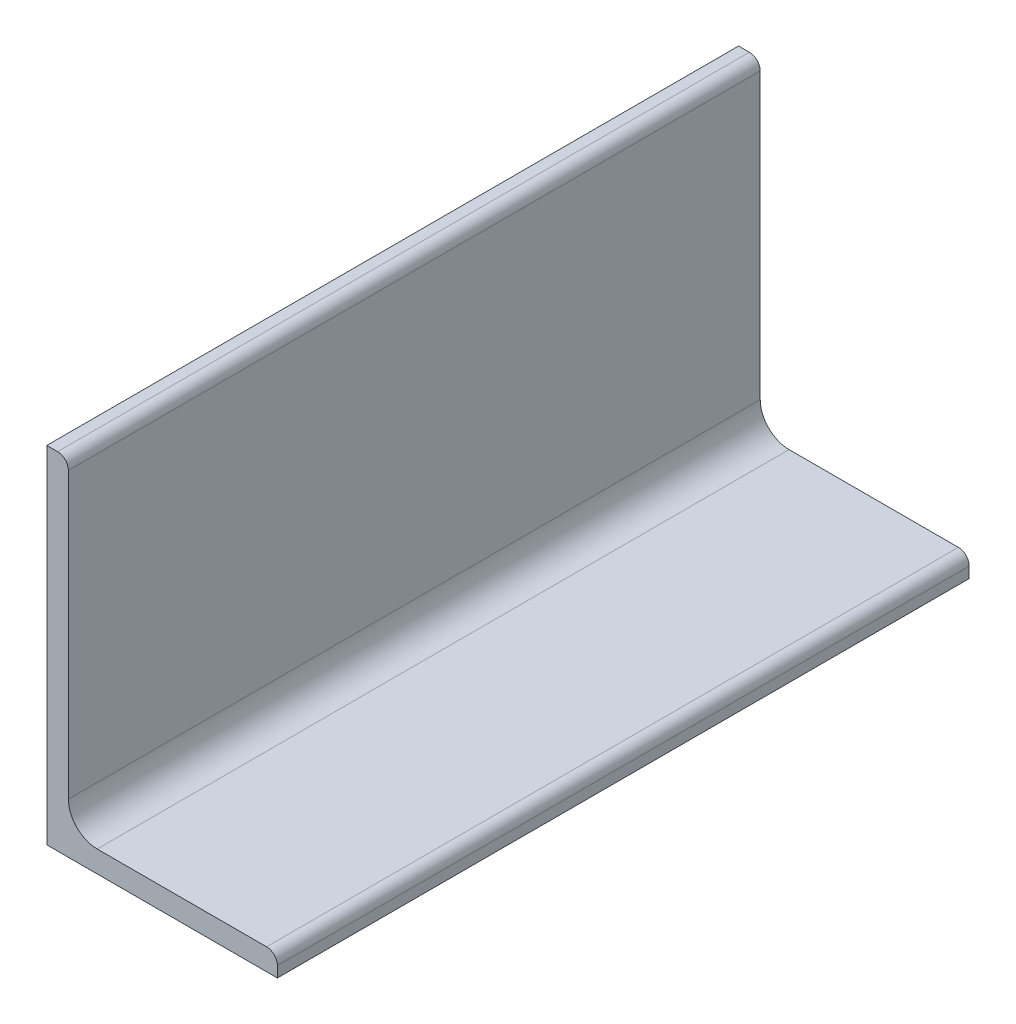
ISO-10303-21;
HEADER;
FILE_DESCRIPTION(('STEP AP214'),'2;1');
FILE_NAME('part.step','',(''),(''),'','','');
FILE_SCHEMA(('AUTOMOTIVE_DESIGN { 1 0 10303 214 1 1 1 1 }'));
ENDSEC;
DATA;
#1=APPLICATION_CONTEXT('core data for automotive mechanical design processes');
#2=APPLICATION_PROTOCOL_DEFINITION('international standard','automotive_design',2000,#1);
#3=PRODUCT_CONTEXT('',#1,'mechanical');
#4=PRODUCT('Part','Part','',(#3));
#5=PRODUCT_RELATED_PRODUCT_CATEGORY('part','',(#4));
#6=PRODUCT_DEFINITION_FORMATION('','',#4);
#7=PRODUCT_DEFINITION_CONTEXT('part definition',#1,'design');
#8=PRODUCT_DEFINITION('design','',#6,#7);
#9=PRODUCT_DEFINITION_SHAPE('','',#8);
#10=(LENGTH_UNIT() NAMED_UNIT(*) SI_UNIT(.MILLI.,.METRE.));
#11=(NAMED_UNIT(*) PLANE_ANGLE_UNIT() SI_UNIT($,.RADIAN.));
#12=(NAMED_UNIT(*) SI_UNIT($,.STERADIAN.) SOLID_ANGLE_UNIT());
#13=UNCERTAINTY_MEASURE_WITH_UNIT(LENGTH_MEASURE(1.E-05),#10,'distance_accuracy_value','');
#14=(GEOMETRIC_REPRESENTATION_CONTEXT(3) GLOBAL_UNCERTAINTY_ASSIGNED_CONTEXT((#13)) GLOBAL_UNIT_ASSIGNED_CONTEXT((#10,
#11,#12)) REPRESENTATION_CONTEXT('',''));
#15=CARTESIAN_POINT('',(0.,0.,0.));
#16=DIRECTION('',(0.,0.,1.));
#17=DIRECTION('',(1.,0.,0.));
#18=AXIS2_PLACEMENT_3D('',#15,#16,#17);
#19=CARTESIAN_POINT('',(0.865045893659089,152.925428131371,304.8));
#20=DIRECTION('',(1.,0.,0.));
#21=DIRECTION('',(0.,0.,-1.));
#22=AXIS2_PLACEMENT_3D('',#19,#20,#21);
#23=PLANE('',#22);
#24=DIRECTION('',(0.,-1.,0.));
#25=VECTOR('',#24,1.);
#26=CARTESIAN_POINT('',(0.865045893659089,152.925428131371,0.));
#27=LINE('',#26,#25);
#28=CARTESIAN_POINT('',(0.865045893659089,152.925428131371,0.));
#29=VERTEX_POINT('',#28);
#30=CARTESIAN_POINT('',(0.865045893659089,0.525428131371291,0.));
#31=VERTEX_POINT('',#30);
#32=EDGE_CURVE('E135',#29,#31,#27,.T.);
#33=ORIENTED_EDGE('',*,*,#32,.T.);
#34=DIRECTION('',(0.,0.,-1.));
#35=VECTOR('',#34,1.);
#36=CARTESIAN_POINT('',(0.865045893659089,0.525428131371291,304.8));
#37=LINE('',#36,#35);
#38=CARTESIAN_POINT('',(0.865045893659089,0.525428131371291,304.8));
#39=VERTEX_POINT('',#38);
#40=EDGE_CURVE('E11',#39,#31,#37,.T.);
#41=ORIENTED_EDGE('',*,*,#40,.F.);
#42=DIRECTION('',(0.,-1.,0.));
#43=VECTOR('',#42,1.);
#44=CARTESIAN_POINT('',(0.865045893659089,152.925428131371,304.8));
#45=LINE('',#44,#43);
#46=CARTESIAN_POINT('',(0.865045893659089,152.925428131371,304.8));
#47=VERTEX_POINT('',#46);
#48=EDGE_CURVE('E151',#47,#39,#45,.T.);
#49=ORIENTED_EDGE('',*,*,#48,.F.);
#50=DIRECTION('',(0.,0.,-1.));
#51=VECTOR('',#50,1.);
#52=CARTESIAN_POINT('',(0.865045893659089,152.925428131371,304.8));
#53=LINE('',#52,#51);
#54=EDGE_CURVE('E131',#47,#29,#53,.T.);
#55=ORIENTED_EDGE('',*,*,#54,.T.);
#56=EDGE_LOOP('',(#33,#41,#49,#55));
#57=FACE_BOUND('',#56,.T.);
#58=ADVANCED_FACE('F33',(#57),#23,.F.);
#59=CARTESIAN_POINT('',(0.865045893659089,0.525428131371291,304.8));
#60=DIRECTION('',(0.,1.,0.));
#61=DIRECTION('',(0.,0.,1.));
#62=AXIS2_PLACEMENT_3D('',#59,#60,#61);
#63=PLANE('',#62);
#64=DIRECTION('',(1.,0.,0.));
#65=VECTOR('',#64,1.);
#66=CARTESIAN_POINT('',(0.865045893659089,0.525428131371291,0.));
#67=LINE('',#66,#65);
#68=CARTESIAN_POINT('',(102.465045893659,0.525428131371291,0.));
#69=VERTEX_POINT('',#68);
#70=EDGE_CURVE('E138',#31,#69,#67,.T.);
#71=ORIENTED_EDGE('',*,*,#70,.T.);
#72=DIRECTION('',(0.,0.,-1.));
#73=VECTOR('',#72,1.);
#74=CARTESIAN_POINT('',(102.465045893659,0.525428131371291,304.8));
#75=LINE('',#74,#73);
#76=CARTESIAN_POINT('',(102.465045893659,0.525428131371291,304.8));
#77=VERTEX_POINT('',#76);
#78=EDGE_CURVE('E41',#77,#69,#75,.T.);
#79=ORIENTED_EDGE('',*,*,#78,.F.);
#80=DIRECTION('',(1.,0.,0.));
#81=VECTOR('',#80,1.);
#82=CARTESIAN_POINT('',(0.865045893659089,0.525428131371291,304.8));
#83=LINE('',#82,#81);
#84=EDGE_CURVE('E95',#39,#77,#83,.T.);
#85=ORIENTED_EDGE('',*,*,#84,.F.);
#86=ORIENTED_EDGE('',*,*,#40,.T.);
#87=EDGE_LOOP('',(#71,#79,#85,#86));
#88=FACE_BOUND('',#87,.T.);
#89=ADVANCED_FACE('F194',(#88),#63,.F.);
#90=CARTESIAN_POINT('',(102.465045893659,0.525428131371291,304.8));
#91=DIRECTION('',(-1.,0.,0.));
#92=DIRECTION('',(0.,0.,1.));
#93=AXIS2_PLACEMENT_3D('',#90,#91,#92);
#94=PLANE('',#93);
#95=DIRECTION('',(0.,1.,0.));
#96=VECTOR('',#95,1.);
#97=CARTESIAN_POINT('',(102.465045893659,0.525428131371291,0.));
#98=LINE('',#97,#96);
#99=CARTESIAN_POINT('',(102.465045893659,5.28792813137129,0.));
#100=VERTEX_POINT('',#99);
#101=EDGE_CURVE('E140',#69,#100,#98,.T.);
#102=ORIENTED_EDGE('',*,*,#101,.T.);
#103=DIRECTION('',(0.,0.,-1.));
#104=VECTOR('',#103,1.);
#105=CARTESIAN_POINT('',(102.465045893659,5.28792813137129,304.8));
#106=LINE('',#105,#104);
#107=CARTESIAN_POINT('',(102.465045893659,5.28792813137129,304.8));
#108=VERTEX_POINT('',#107);
#109=EDGE_CURVE('E161',#108,#100,#106,.T.);
#110=ORIENTED_EDGE('',*,*,#109,.F.);
#111=DIRECTION('',(0.,1.,0.));
#112=VECTOR('',#111,1.);
#113=CARTESIAN_POINT('',(102.465045893659,0.525428131371291,304.8));
#114=LINE('',#113,#112);
#115=EDGE_CURVE('E169',#77,#108,#114,.T.);
#116=ORIENTED_EDGE('',*,*,#115,.F.);
#117=ORIENTED_EDGE('',*,*,#78,.T.);
#118=EDGE_LOOP('',(#102,#110,#116,#117));
#119=FACE_BOUND('',#118,.T.);
#120=ADVANCED_FACE('F167',(#119),#94,.F.);
#121=CARTESIAN_POINT('',(97.7025458936591,5.28792813137129,304.8));
#122=DIRECTION('',(0.,0.,-1.));
#123=DIRECTION('',(-1.,0.,0.));
#124=AXIS2_PLACEMENT_3D('',#121,#122,#123);
#125=CYLINDRICAL_SURFACE('',#124,4.7625);
#126=CARTESIAN_POINT('',(97.7025458936591,5.28792813137129,0.));
#127=DIRECTION('',(0.,0.,1.));
#128=DIRECTION('',(1.,0.,0.));
#129=AXIS2_PLACEMENT_3D('',#126,#127,#128);
#130=CIRCLE('',#129,4.7625);
#131=CARTESIAN_POINT('',(97.7025458936591,10.0504281313713,0.));
#132=VERTEX_POINT('',#131);
#133=EDGE_CURVE('E142',#100,#132,#130,.T.);
#134=ORIENTED_EDGE('',*,*,#133,.T.);
#135=DIRECTION('',(0.,0.,-1.));
#136=VECTOR('',#135,1.);
#137=CARTESIAN_POINT('',(97.7025458936591,10.0504281313713,304.8));
#138=LINE('',#137,#136);
#139=CARTESIAN_POINT('',(97.7025458936591,10.0504281313713,304.8));
#140=VERTEX_POINT('',#139);
#141=EDGE_CURVE('E158',#140,#132,#138,.T.);
#142=ORIENTED_EDGE('',*,*,#141,.F.);
#143=CARTESIAN_POINT('',(97.7025458936591,5.28792813137129,304.8));
#144=DIRECTION('',(0.,0.,1.));
#145=DIRECTION('',(1.,0.,0.));
#146=AXIS2_PLACEMENT_3D('',#143,#144,#145);
#147=CIRCLE('',#146,4.7625);
#148=EDGE_CURVE('E185',#108,#140,#147,.T.);
#149=ORIENTED_EDGE('',*,*,#148,.F.);
#150=ORIENTED_EDGE('',*,*,#109,.T.);
#151=EDGE_LOOP('',(#134,#142,#149,#150));
#152=FACE_BOUND('',#151,.T.);
#153=ADVANCED_FACE('F178',(#152),#125,.T.);
#154=CARTESIAN_POINT('',(97.7025458936591,10.0504281313713,304.8));
#155=DIRECTION('',(0.,-1.,0.));
#156=DIRECTION('',(0.,0.,-1.));
#157=AXIS2_PLACEMENT_3D('',#154,#155,#156);
#158=PLANE('',#157);
#159=DIRECTION('',(-1.,0.,0.));
#160=VECTOR('',#159,1.);
#161=CARTESIAN_POINT('',(97.7025458936591,10.0504281313713,0.));
#162=LINE('',#161,#160);
#163=CARTESIAN_POINT('',(23.0900458936591,10.0504281313713,0.));
#164=VERTEX_POINT('',#163);
#165=EDGE_CURVE('E144',#132,#164,#162,.T.);
#166=ORIENTED_EDGE('',*,*,#165,.T.);
#167=DIRECTION('',(0.,0.,-1.));
#168=VECTOR('',#167,1.);
#169=CARTESIAN_POINT('',(23.0900458936591,10.0504281313713,304.8));
#170=LINE('',#169,#168);
#171=CARTESIAN_POINT('',(23.0900458936591,10.0504281313713,304.8));
#172=VERTEX_POINT('',#171);
#173=EDGE_CURVE('E155',#172,#164,#170,.T.);
#174=ORIENTED_EDGE('',*,*,#173,.F.);
#175=DIRECTION('',(-1.,0.,0.));
#176=VECTOR('',#175,1.);
#177=CARTESIAN_POINT('',(97.7025458936591,10.0504281313713,304.8));
#178=LINE('',#177,#176);
#179=EDGE_CURVE('E184',#140,#172,#178,.T.);
#180=ORIENTED_EDGE('',*,*,#179,.F.);
#181=ORIENTED_EDGE('',*,*,#141,.T.);
#182=EDGE_LOOP('',(#166,#174,#180,#181));
#183=FACE_BOUND('',#182,.T.);
#184=ADVANCED_FACE('F182',(#183),#158,.F.);
#185=CARTESIAN_POINT('',(23.0900458936591,22.7504281313713,304.8));
#186=DIRECTION('',(0.,0.,-1.));
#187=DIRECTION('',(-1.,0.,0.));
#188=AXIS2_PLACEMENT_3D('',#185,#186,#187);
#189=CYLINDRICAL_SURFACE('',#188,12.7);
#190=CARTESIAN_POINT('',(23.0900458936591,22.7504281313713,0.));
#191=DIRECTION('',(0.,0.,-1.));
#192=DIRECTION('',(1.,0.,0.));
#193=AXIS2_PLACEMENT_3D('',#190,#191,#192);
#194=CIRCLE('',#193,12.7);
#195=CARTESIAN_POINT('',(10.3900458936591,22.7504281313713,0.));
#196=VERTEX_POINT('',#195);
#197=EDGE_CURVE('E146',#164,#196,#194,.T.);
#198=ORIENTED_EDGE('',*,*,#197,.T.);
#199=DIRECTION('',(0.,0.,-1.));
#200=VECTOR('',#199,1.);
#201=CARTESIAN_POINT('',(10.3900458936591,22.7504281313713,304.8));
#202=LINE('',#201,#200);
#203=CARTESIAN_POINT('',(10.3900458936591,22.7504281313713,304.8));
#204=VERTEX_POINT('',#203);
#205=EDGE_CURVE('E126',#204,#196,#202,.T.);
#206=ORIENTED_EDGE('',*,*,#205,.F.);
#207=CARTESIAN_POINT('',(23.0900458936591,22.7504281313713,304.8));
#208=DIRECTION('',(0.,0.,-1.));
#209=DIRECTION('',(1.,0.,0.));
#210=AXIS2_PLACEMENT_3D('',#207,#208,#209);
#211=CIRCLE('',#210,12.7);
#212=EDGE_CURVE('E117',#172,#204,#211,.T.);
#213=ORIENTED_EDGE('',*,*,#212,.F.);
#214=ORIENTED_EDGE('',*,*,#173,.T.);
#215=EDGE_LOOP('',(#198,#206,#213,#214));
#216=FACE_BOUND('',#215,.T.);
#217=ADVANCED_FACE('F206',(#216),#189,.F.);
#218=CARTESIAN_POINT('',(10.3900458936591,22.7504281313713,304.8));
#219=DIRECTION('',(-1.,0.,0.));
#220=DIRECTION('',(0.,0.,1.));
#221=AXIS2_PLACEMENT_3D('',#218,#219,#220);
#222=PLANE('',#221);
#223=DIRECTION('',(0.,1.,0.));
#224=VECTOR('',#223,1.);
#225=CARTESIAN_POINT('',(10.3900458936591,22.7504281313713,0.));
#226=LINE('',#225,#224);
#227=CARTESIAN_POINT('',(10.3900458936591,148.162928131371,0.));
#228=VERTEX_POINT('',#227);
#229=EDGE_CURVE('E125',#196,#228,#226,.T.);
#230=ORIENTED_EDGE('',*,*,#229,.T.);
#231=DIRECTION('',(0.,0.,-1.));
#232=VECTOR('',#231,1.);
#233=CARTESIAN_POINT('',(10.3900458936591,148.162928131371,304.8));
#234=LINE('',#233,#232);
#235=CARTESIAN_POINT('',(10.3900458936591,148.162928131371,304.8));
#236=VERTEX_POINT('',#235);
#237=EDGE_CURVE('E122',#236,#228,#234,.T.);
#238=ORIENTED_EDGE('',*,*,#237,.F.);
#239=DIRECTION('',(0.,1.,0.));
#240=VECTOR('',#239,1.);
#241=CARTESIAN_POINT('',(10.3900458936591,22.7504281313713,304.8));
#242=LINE('',#241,#240);
#243=EDGE_CURVE('E111',#204,#236,#242,.T.);
#244=ORIENTED_EDGE('',*,*,#243,.F.);
#245=ORIENTED_EDGE('',*,*,#205,.T.);
#246=EDGE_LOOP('',(#230,#238,#244,#245));
#247=FACE_BOUND('',#246,.T.);
#248=ADVANCED_FACE('F123',(#247),#222,.F.);
#249=CARTESIAN_POINT('',(5.62754589365909,148.162928131371,304.8));
#250=DIRECTION('',(0.,0.,-1.));
#251=DIRECTION('',(-1.,0.,0.));
#252=AXIS2_PLACEMENT_3D('',#249,#250,#251);
#253=CYLINDRICAL_SURFACE('',#252,4.7625);
#254=CARTESIAN_POINT('',(5.62754589365909,148.162928131371,0.));
#255=DIRECTION('',(0.,0.,1.));
#256=DIRECTION('',(1.,0.,0.));
#257=AXIS2_PLACEMENT_3D('',#254,#255,#256);
#258=CIRCLE('',#257,4.7625);
#259=CARTESIAN_POINT('',(5.62754589365909,152.925428131371,0.));
#260=VERTEX_POINT('',#259);
#261=EDGE_CURVE('E81',#228,#260,#258,.T.);
#262=ORIENTED_EDGE('',*,*,#261,.T.);
#263=DIRECTION('',(0.,0.,-1.));
#264=VECTOR('',#263,1.);
#265=CARTESIAN_POINT('',(5.62754589365909,152.925428131371,304.8));
#266=LINE('',#265,#264);
#267=CARTESIAN_POINT('',(5.62754589365909,152.925428131371,304.8));
#268=VERTEX_POINT('',#267);
#269=EDGE_CURVE('E127',#268,#260,#266,.T.);
#270=ORIENTED_EDGE('',*,*,#269,.F.);
#271=CARTESIAN_POINT('',(5.62754589365909,148.162928131371,304.8));
#272=DIRECTION('',(0.,0.,1.));
#273=DIRECTION('',(1.,0.,0.));
#274=AXIS2_PLACEMENT_3D('',#271,#272,#273);
#275=CIRCLE('',#274,4.7625);
#276=EDGE_CURVE('E115',#236,#268,#275,.T.);
#277=ORIENTED_EDGE('',*,*,#276,.F.);
#278=ORIENTED_EDGE('',*,*,#237,.T.);
#279=EDGE_LOOP('',(#262,#270,#277,#278));
#280=FACE_BOUND('',#279,.T.);
#281=ADVANCED_FACE('F129',(#280),#253,.T.);
#282=CARTESIAN_POINT('',(5.62754589365909,152.925428131371,304.8));
#283=DIRECTION('',(0.,-1.,0.));
#284=DIRECTION('',(0.,0.,-1.));
#285=AXIS2_PLACEMENT_3D('',#282,#283,#284);
#286=PLANE('',#285);
#287=DIRECTION('',(-1.,0.,0.));
#288=VECTOR('',#287,1.);
#289=CARTESIAN_POINT('',(5.62754589365909,152.925428131371,0.));
#290=LINE('',#289,#288);
#291=EDGE_CURVE('E87',#260,#29,#290,.T.);
#292=ORIENTED_EDGE('',*,*,#291,.T.);
#293=ORIENTED_EDGE('',*,*,#54,.F.);
#294=DIRECTION('',(-1.,0.,0.));
#295=VECTOR('',#294,1.);
#296=CARTESIAN_POINT('',(5.62754589365909,152.925428131371,304.8));
#297=LINE('',#296,#295);
#298=EDGE_CURVE('E49',#268,#47,#297,.T.);
#299=ORIENTED_EDGE('',*,*,#298,.F.);
#300=ORIENTED_EDGE('',*,*,#269,.T.);
#301=EDGE_LOOP('',(#292,#293,#299,#300));
#302=FACE_BOUND('',#301,.T.);
#303=ADVANCED_FACE('F214',(#302),#286,.F.);
#304=CARTESIAN_POINT('',(97.7025458936591,5.28792813137129,304.8));
#305=DIRECTION('',(0.,0.,1.));
#306=DIRECTION('',(1.,0.,0.));
#307=AXIS2_PLACEMENT_3D('',#304,#305,#306);
#308=PLANE('',#307);
#309=ORIENTED_EDGE('',*,*,#48,.T.);
#310=ORIENTED_EDGE('',*,*,#84,.T.);
#311=ORIENTED_EDGE('',*,*,#115,.T.);
#312=ORIENTED_EDGE('',*,*,#148,.T.);
#313=ORIENTED_EDGE('',*,*,#179,.T.);
#314=ORIENTED_EDGE('',*,*,#212,.T.);
#315=ORIENTED_EDGE('',*,*,#243,.T.);
#316=ORIENTED_EDGE('',*,*,#276,.T.);
#317=ORIENTED_EDGE('',*,*,#298,.T.);
#318=EDGE_LOOP('',(#309,#310,#311,#312,#313,#314,#315,#316,#317));
#319=FACE_BOUND('',#318,.T.);
#320=ADVANCED_FACE('F113',(#319),#308,.T.);
#321=CARTESIAN_POINT('',(97.7025458936591,5.28792813137129,0.));
#322=DIRECTION('',(0.,0.,1.));
#323=DIRECTION('',(1.,0.,0.));
#324=AXIS2_PLACEMENT_3D('',#321,#322,#323);
#325=PLANE('',#324);
#326=ORIENTED_EDGE('',*,*,#32,.F.);
#327=ORIENTED_EDGE('',*,*,#291,.F.);
#328=ORIENTED_EDGE('',*,*,#261,.F.);
#329=ORIENTED_EDGE('',*,*,#229,.F.);
#330=ORIENTED_EDGE('',*,*,#197,.F.);
#331=ORIENTED_EDGE('',*,*,#165,.F.);
#332=ORIENTED_EDGE('',*,*,#133,.F.);
#333=ORIENTED_EDGE('',*,*,#101,.F.);
#334=ORIENTED_EDGE('',*,*,#70,.F.);
#335=EDGE_LOOP('',(#326,#327,#328,#329,#330,#331,#332,#333,#334));
#336=FACE_BOUND('',#335,.T.);
#337=ADVANCED_FACE('F173',(#336),#325,.F.);
#338=CLOSED_SHELL('',(#58,#89,#120,#153,#184,#217,#248,#281,#303,#320,#337));
#339=MANIFOLD_SOLID_BREP('B2',#338);
#340=ADVANCED_BREP_SHAPE_REPRESENTATION('',(#18,#339),#14);
#341=SHAPE_DEFINITION_REPRESENTATION(#9,#340);
ENDSEC;
END-ISO-10303-21;
